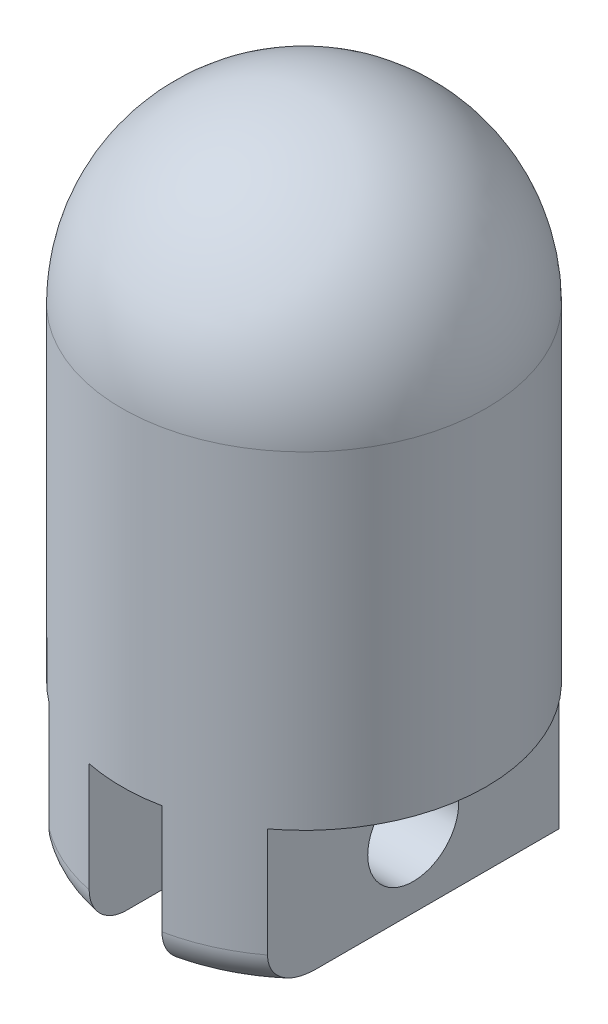
ISO-10303-21;
HEADER;
FILE_DESCRIPTION(('STEP AP214'),'2;1');
FILE_NAME('part.step','',(''),(''),'','','');
FILE_SCHEMA(('AUTOMOTIVE_DESIGN { 1 0 10303 214 1 1 1 1 }'));
ENDSEC;
DATA;
#1=APPLICATION_CONTEXT('core data for automotive mechanical design processes');
#2=APPLICATION_PROTOCOL_DEFINITION('international standard','automotive_design',2000,#1);
#3=PRODUCT_CONTEXT('',#1,'mechanical');
#4=PRODUCT('Part','Part','',(#3));
#5=PRODUCT_RELATED_PRODUCT_CATEGORY('part','',(#4));
#6=PRODUCT_DEFINITION_FORMATION('','',#4);
#7=PRODUCT_DEFINITION_CONTEXT('part definition',#1,'design');
#8=PRODUCT_DEFINITION('design','',#6,#7);
#9=PRODUCT_DEFINITION_SHAPE('','',#8);
#10=(LENGTH_UNIT() NAMED_UNIT(*) SI_UNIT(.MILLI.,.METRE.));
#11=(NAMED_UNIT(*) PLANE_ANGLE_UNIT() SI_UNIT($,.RADIAN.));
#12=(NAMED_UNIT(*) SI_UNIT($,.STERADIAN.) SOLID_ANGLE_UNIT());
#13=UNCERTAINTY_MEASURE_WITH_UNIT(LENGTH_MEASURE(1.E-05),#10,'distance_accuracy_value','');
#14=(GEOMETRIC_REPRESENTATION_CONTEXT(3) GLOBAL_UNCERTAINTY_ASSIGNED_CONTEXT((#13)) GLOBAL_UNIT_ASSIGNED_CONTEXT((#10,
#11,#12)) REPRESENTATION_CONTEXT('',''));
#15=CARTESIAN_POINT('',(0.,0.,0.));
#16=DIRECTION('',(0.,0.,1.));
#17=DIRECTION('',(1.,0.,0.));
#18=AXIS2_PLACEMENT_3D('',#15,#16,#17);
#19=CARTESIAN_POINT('',(0.,0.,0.));
#20=DIRECTION('',(0.,1.,0.));
#21=DIRECTION('',(0.,0.,1.));
#22=AXIS2_PLACEMENT_3D('',#19,#20,#21);
#23=PLANE('',#22);
#24=DIRECTION('',(0.,0.,-1.));
#25=VECTOR('',#24,1.);
#26=CARTESIAN_POINT('',(7.62,0.,10.16));
#27=LINE('',#26,#25);
#28=CARTESIAN_POINT('',(7.62,0.,6.72020833010405));
#29=VERTEX_POINT('',#28);
#30=CARTESIAN_POINT('',(7.62,0.,-10.16));
#31=VERTEX_POINT('',#30);
#32=EDGE_CURVE('E163',#29,#31,#27,.T.);
#33=ORIENTED_EDGE('',*,*,#32,.F.);
#34=CARTESIAN_POINT('',(0.,0.,0.));
#35=DIRECTION('',(0.,1.,0.));
#36=DIRECTION('',(0.,0.,1.));
#37=AXIS2_PLACEMENT_3D('',#34,#35,#36);
#38=CIRCLE('',#37,10.16);
#39=CARTESIAN_POINT('',(2.54,0.,9.83737769936684));
#40=VERTEX_POINT('',#39);
#41=EDGE_CURVE('E285',#29,#40,#38,.F.);
#42=ORIENTED_EDGE('',*,*,#41,.T.);
#43=DIRECTION('',(0.,0.,1.));
#44=VECTOR('',#43,1.);
#45=CARTESIAN_POINT('',(2.54,0.,12.4434078933385));
#46=LINE('',#45,#44);
#47=CARTESIAN_POINT('',(2.54,0.,-12.4434078933385));
#48=VERTEX_POINT('',#47);
#49=EDGE_CURVE('E181',#48,#40,#46,.T.);
#50=ORIENTED_EDGE('',*,*,#49,.F.);
#51=CARTESIAN_POINT('',(0.,0.,0.));
#52=DIRECTION('',(0.,-1.,0.));
#53=DIRECTION('',(0.,0.,-1.));
#54=AXIS2_PLACEMENT_3D('',#51,#52,#53);
#55=CIRCLE('',#54,12.7);
#56=EDGE_CURVE('E212',#48,#31,#55,.T.);
#57=ORIENTED_EDGE('',*,*,#56,.T.);
#58=EDGE_LOOP('',(#33,#42,#50,#57));
#59=FACE_BOUND('',#58,.T.);
#60=ADVANCED_FACE('F39',(#59),#23,.F.);
#61=DIRECTION('',(0.,0.,-1.));
#62=VECTOR('',#61,1.);
#63=CARTESIAN_POINT('',(-2.54,0.,12.4434078933385));
#64=LINE('',#63,#62);
#65=CARTESIAN_POINT('',(-2.54,0.,9.83737769936684));
#66=VERTEX_POINT('',#65);
#67=CARTESIAN_POINT('',(-2.54,0.,-12.4434078933385));
#68=VERTEX_POINT('',#67);
#69=EDGE_CURVE('E155',#66,#68,#64,.T.);
#70=ORIENTED_EDGE('',*,*,#69,.F.);
#71=CARTESIAN_POINT('',(0.,0.,0.));
#72=DIRECTION('',(0.,1.,0.));
#73=DIRECTION('',(0.,0.,1.));
#74=AXIS2_PLACEMENT_3D('',#71,#72,#73);
#75=CIRCLE('',#74,10.16);
#76=CARTESIAN_POINT('',(-7.62,0.,6.72020833010406));
#77=VERTEX_POINT('',#76);
#78=EDGE_CURVE('E234',#66,#77,#75,.F.);
#79=ORIENTED_EDGE('',*,*,#78,.T.);
#80=DIRECTION('',(0.,0.,1.));
#81=VECTOR('',#80,1.);
#82=CARTESIAN_POINT('',(-7.62,0.,10.16));
#83=LINE('',#82,#81);
#84=CARTESIAN_POINT('',(-7.62,0.,-10.16));
#85=VERTEX_POINT('',#84);
#86=EDGE_CURVE('E136',#85,#77,#83,.T.);
#87=ORIENTED_EDGE('',*,*,#86,.F.);
#88=EDGE_CURVE('E151',#85,#68,#55,.T.);
#89=ORIENTED_EDGE('',*,*,#88,.T.);
#90=EDGE_LOOP('',(#70,#79,#87,#89));
#91=FACE_BOUND('',#90,.T.);
#92=ADVANCED_FACE('F337',(#91),#23,.F.);
#93=CARTESIAN_POINT('',(0.,33.02,0.));
#94=DIRECTION('',(0.,-1.,0.));
#95=DIRECTION('',(1.,0.,0.));
#96=AXIS2_PLACEMENT_3D('',#93,#94,#95);
#97=SPHERICAL_SURFACE('',#96,12.7);
#98=CARTESIAN_POINT('',(0.,33.02,0.));
#99=DIRECTION('',(0.,-1.,0.));
#100=DIRECTION('',(0.,0.,-1.));
#101=AXIS2_PLACEMENT_3D('',#98,#99,#100);
#102=CIRCLE('',#101,12.7);
#103=CARTESIAN_POINT('',(0.,33.02,-12.7));
#104=VERTEX_POINT('',#103);
#105=EDGE_CURVE('E216',#104,#104,#102,.T.);
#106=ORIENTED_EDGE('',*,*,#105,.F.);
#107=EDGE_LOOP('',(#106));
#108=FACE_BOUND('',#107,.T.);
#109=ADVANCED_FACE('F341',(#108),#97,.T.);
#110=CARTESIAN_POINT('',(0.,0.,0.));
#111=DIRECTION('',(0.,-1.,0.));
#112=DIRECTION('',(0.,0.,-1.));
#113=AXIS2_PLACEMENT_3D('',#110,#111,#112);
#114=CYLINDRICAL_SURFACE('',#113,12.7);
#115=DIRECTION('',(0.,-1.,0.));
#116=VECTOR('',#115,1.);
#117=CARTESIAN_POINT('',(-7.62,10.16,10.16));
#118=LINE('',#117,#116);
#119=CARTESIAN_POINT('',(-7.62,10.16,10.16));
#120=VERTEX_POINT('',#119);
#121=CARTESIAN_POINT('',(-7.62,2.54,10.16));
#122=VERTEX_POINT('',#121);
#123=EDGE_CURVE('E143',#120,#122,#118,.T.);
#124=ORIENTED_EDGE('',*,*,#123,.T.);
#125=CARTESIAN_POINT('',(0.,2.54,0.));
#126=DIRECTION('',(0.,1.,0.));
#127=DIRECTION('',(0.,0.,1.));
#128=AXIS2_PLACEMENT_3D('',#125,#126,#127);
#129=CIRCLE('',#128,12.7);
#130=CARTESIAN_POINT('',(-2.54,2.54,12.4434078933385));
#131=VERTEX_POINT('',#130);
#132=EDGE_CURVE('E294',#122,#131,#129,.T.);
#133=ORIENTED_EDGE('',*,*,#132,.T.);
#134=DIRECTION('',(0.,-1.,0.));
#135=VECTOR('',#134,1.);
#136=CARTESIAN_POINT('',(-2.54,10.16,12.4434078933385));
#137=LINE('',#136,#135);
#138=CARTESIAN_POINT('',(-2.54,10.16,12.4434078933385));
#139=VERTEX_POINT('',#138);
#140=EDGE_CURVE('E193',#139,#131,#137,.T.);
#141=ORIENTED_EDGE('',*,*,#140,.F.);
#142=CARTESIAN_POINT('',(0.,10.16,0.));
#143=DIRECTION('',(0.,-1.,0.));
#144=DIRECTION('',(0.,0.,-1.));
#145=AXIS2_PLACEMENT_3D('',#142,#143,#144);
#146=CIRCLE('',#145,12.7);
#147=CARTESIAN_POINT('',(2.54,10.16,12.4434078933385));
#148=VERTEX_POINT('',#147);
#149=EDGE_CURVE('E176',#148,#139,#146,.T.);
#150=ORIENTED_EDGE('',*,*,#149,.F.);
#151=DIRECTION('',(0.,-1.,0.));
#152=VECTOR('',#151,1.);
#153=CARTESIAN_POINT('',(2.54,10.16,12.4434078933385));
#154=LINE('',#153,#152);
#155=CARTESIAN_POINT('',(2.54,2.54,12.4434078933385));
#156=VERTEX_POINT('',#155);
#157=EDGE_CURVE('E199',#148,#156,#154,.T.);
#158=ORIENTED_EDGE('',*,*,#157,.T.);
#159=CARTESIAN_POINT('',(0.,2.54,0.));
#160=DIRECTION('',(0.,1.,0.));
#161=DIRECTION('',(0.,0.,1.));
#162=AXIS2_PLACEMENT_3D('',#159,#160,#161);
#163=CIRCLE('',#162,12.7);
#164=CARTESIAN_POINT('',(7.62,2.54,10.16));
#165=VERTEX_POINT('',#164);
#166=EDGE_CURVE('E246',#156,#165,#163,.T.);
#167=ORIENTED_EDGE('',*,*,#166,.T.);
#168=DIRECTION('',(0.,-1.,0.));
#169=VECTOR('',#168,1.);
#170=CARTESIAN_POINT('',(7.62,10.16,10.16));
#171=LINE('',#170,#169);
#172=CARTESIAN_POINT('',(7.62,10.16,10.16));
#173=VERTEX_POINT('',#172);
#174=EDGE_CURVE('E166',#173,#165,#171,.T.);
#175=ORIENTED_EDGE('',*,*,#174,.F.);
#176=CARTESIAN_POINT('',(0.,10.16,0.));
#177=DIRECTION('',(0.,-1.,0.));
#178=DIRECTION('',(0.,0.,-1.));
#179=AXIS2_PLACEMENT_3D('',#176,#177,#178);
#180=CIRCLE('',#179,12.7);
#181=CARTESIAN_POINT('',(7.62,10.16,-10.16));
#182=VERTEX_POINT('',#181);
#183=EDGE_CURVE('E159',#182,#173,#180,.T.);
#184=ORIENTED_EDGE('',*,*,#183,.F.);
#185=DIRECTION('',(0.,-1.,0.));
#186=VECTOR('',#185,1.);
#187=CARTESIAN_POINT('',(7.62,10.16,-10.16));
#188=LINE('',#187,#186);
#189=EDGE_CURVE('E170',#182,#31,#188,.T.);
#190=ORIENTED_EDGE('',*,*,#189,.T.);
#191=ORIENTED_EDGE('',*,*,#56,.F.);
#192=DIRECTION('',(0.,-1.,0.));
#193=VECTOR('',#192,1.);
#194=CARTESIAN_POINT('',(2.54,10.16,-12.4434078933385));
#195=LINE('',#194,#193);
#196=CARTESIAN_POINT('',(2.54,10.16,-12.4434078933385));
#197=VERTEX_POINT('',#196);
#198=EDGE_CURVE('E203',#197,#48,#195,.T.);
#199=ORIENTED_EDGE('',*,*,#198,.F.);
#200=CARTESIAN_POINT('',(0.,10.16,0.));
#201=DIRECTION('',(0.,-1.,0.));
#202=DIRECTION('',(0.,0.,-1.));
#203=AXIS2_PLACEMENT_3D('',#200,#201,#202);
#204=CIRCLE('',#203,12.7);
#205=CARTESIAN_POINT('',(-2.54,10.16,-12.4434078933385));
#206=VERTEX_POINT('',#205);
#207=EDGE_CURVE('E186',#206,#197,#204,.T.);
#208=ORIENTED_EDGE('',*,*,#207,.F.);
#209=DIRECTION('',(0.,-1.,0.));
#210=VECTOR('',#209,1.);
#211=CARTESIAN_POINT('',(-2.54,10.16,-12.4434078933385));
#212=LINE('',#211,#210);
#213=EDGE_CURVE('E206',#206,#68,#212,.T.);
#214=ORIENTED_EDGE('',*,*,#213,.T.);
#215=ORIENTED_EDGE('',*,*,#88,.F.);
#216=DIRECTION('',(0.,-1.,0.));
#217=VECTOR('',#216,1.);
#218=CARTESIAN_POINT('',(-7.62,10.16,-10.16));
#219=LINE('',#218,#217);
#220=CARTESIAN_POINT('',(-7.62,10.16,-10.16));
#221=VERTEX_POINT('',#220);
#222=EDGE_CURVE('E141',#221,#85,#219,.T.);
#223=ORIENTED_EDGE('',*,*,#222,.F.);
#224=CARTESIAN_POINT('',(0.,10.16,0.));
#225=DIRECTION('',(0.,-1.,0.));
#226=DIRECTION('',(0.,0.,-1.));
#227=AXIS2_PLACEMENT_3D('',#224,#225,#226);
#228=CIRCLE('',#227,12.7);
#229=EDGE_CURVE('E127',#120,#221,#228,.T.);
#230=ORIENTED_EDGE('',*,*,#229,.F.);
#231=EDGE_LOOP('',(#124,#133,#141,#150,#158,#167,#175,#184,#190,#191,#199,#208,#214,#215,#223,#230));
#232=FACE_BOUND('',#231,.T.);
#233=ORIENTED_EDGE('',*,*,#105,.T.);
#234=EDGE_LOOP('',(#233));
#235=FACE_BOUND('',#234,.T.);
#236=ADVANCED_FACE('F147',(#232,#235),#114,.T.);
#237=CARTESIAN_POINT('',(0.,10.16,0.));
#238=DIRECTION('',(0.,-1.,0.));
#239=DIRECTION('',(0.,0.,-1.));
#240=AXIS2_PLACEMENT_3D('',#237,#238,#239);
#241=PLANE('',#240);
#242=CARTESIAN_POINT('',(0.,10.16,0.));
#243=DIRECTION('',(0.,-1.,0.));
#244=DIRECTION('',(0.,0.,-1.));
#245=AXIS2_PLACEMENT_3D('',#242,#243,#244);
#246=CIRCLE('',#245,2.54);
#247=CARTESIAN_POINT('',(-2.54,10.16,0.));
#248=VERTEX_POINT('',#247);
#249=CARTESIAN_POINT('',(2.54,10.16,0.));
#250=VERTEX_POINT('',#249);
#251=EDGE_CURVE('E227',#248,#250,#246,.F.);
#252=ORIENTED_EDGE('',*,*,#251,.T.);
#253=DIRECTION('',(0.,0.,1.));
#254=VECTOR('',#253,1.);
#255=CARTESIAN_POINT('',(2.54,10.16,12.4434078933385));
#256=LINE('',#255,#254);
#257=EDGE_CURVE('E189',#250,#148,#256,.T.);
#258=ORIENTED_EDGE('',*,*,#257,.T.);
#259=ORIENTED_EDGE('',*,*,#149,.T.);
#260=DIRECTION('',(0.,0.,-1.));
#261=VECTOR('',#260,1.);
#262=CARTESIAN_POINT('',(-2.54,10.16,12.4434078933385));
#263=LINE('',#262,#261);
#264=EDGE_CURVE('E182',#139,#248,#263,.T.);
#265=ORIENTED_EDGE('',*,*,#264,.T.);
#266=EDGE_LOOP('',(#252,#258,#259,#265));
#267=FACE_BOUND('',#266,.T.);
#268=ADVANCED_FACE('F267',(#267),#241,.T.);
#269=EDGE_CURVE('E224',#250,#248,#246,.F.);
#270=ORIENTED_EDGE('',*,*,#269,.T.);
#271=EDGE_CURVE('E180',#248,#206,#263,.T.);
#272=ORIENTED_EDGE('',*,*,#271,.T.);
#273=ORIENTED_EDGE('',*,*,#207,.T.);
#274=EDGE_CURVE('E190',#197,#250,#256,.T.);
#275=ORIENTED_EDGE('',*,*,#274,.T.);
#276=EDGE_LOOP('',(#270,#272,#273,#275));
#277=FACE_BOUND('',#276,.T.);
#278=ADVANCED_FACE('F270',(#277),#241,.T.);
#279=CARTESIAN_POINT('',(2.54,10.16,12.4434078933385));
#280=DIRECTION('',(1.,0.,0.));
#281=DIRECTION('',(0.,0.,-1.));
#282=AXIS2_PLACEMENT_3D('',#279,#280,#281);
#283=PLANE('',#282);
#284=CARTESIAN_POINT('',(2.54,5.08,0.));
#285=DIRECTION('',(1.,0.,0.));
#286=DIRECTION('',(0.,0.,-1.));
#287=AXIS2_PLACEMENT_3D('',#284,#285,#286);
#288=CIRCLE('',#287,3.175);
#289=CARTESIAN_POINT('',(2.54,5.08,-3.175));
#290=VERTEX_POINT('',#289);
#291=EDGE_CURVE('E169',#290,#290,#288,.T.);
#292=ORIENTED_EDGE('',*,*,#291,.T.);
#293=EDGE_LOOP('',(#292));
#294=FACE_BOUND('',#293,.T.);
#295=ORIENTED_EDGE('',*,*,#49,.T.);
#296=CARTESIAN_POINT('',(2.54,0.,9.83737769936684));
#297=CARTESIAN_POINT('',(2.54,1.45425618167772E-06,9.91230037919097));
#298=CARTESIAN_POINT('',(2.54,0.00310981694239159,9.98718958698183));
#299=CARTESIAN_POINT('',(2.54,0.0155436658062321,10.1364549391743));
#300=CARTESIAN_POINT('',(2.54,0.02486959755277,10.2108310464197));
#301=CARTESIAN_POINT('',(2.54,0.0621632906921143,10.4324166619154));
#302=CARTESIAN_POINT('',(2.54,0.0994469487679672,10.578173392806));
#303=CARTESIAN_POINT('',(2.54,0.198147270173078,10.8613867869284));
#304=CARTESIAN_POINT('',(2.54,0.259589645281355,10.9988344265028));
#305=CARTESIAN_POINT('',(2.54,0.405105398356876,11.261129326273));
#306=CARTESIAN_POINT('',(2.54,0.48916633258982,11.3859834630861));
#307=CARTESIAN_POINT('',(2.54,0.675862847898282,11.6169487416195));
#308=CARTESIAN_POINT('',(2.54,0.778107822291197,11.7233756291323));
#309=CARTESIAN_POINT('',(2.54,0.999446084232905,11.9170573290163));
#310=CARTESIAN_POINT('',(2.54,1.11854228435804,12.0043088204298));
#311=CARTESIAN_POINT('',(2.54,1.36703211456297,12.1549133561521));
#312=CARTESIAN_POINT('',(2.54,1.49610667508061,12.2187937971196));
#313=CARTESIAN_POINT('',(2.54,1.76323440237714,12.3234975537076));
#314=CARTESIAN_POINT('',(2.54,1.90127928169638,12.3643418234144));
#315=CARTESIAN_POINT('',(2.54,2.12369890518237,12.4097791905788));
#316=CARTESIAN_POINT('',(2.54,2.20651763910892,12.4223841804546));
#317=CARTESIAN_POINT('',(2.54,2.37287781294579,12.4391952140899));
#318=CARTESIAN_POINT('',(2.54,2.45641798662608,12.4434137919833));
#319=CARTESIAN_POINT('',(2.54,2.54,12.4434078933385));
#320=B_SPLINE_CURVE_WITH_KNOTS('',3,(#296,#297,#298,#299,#300,#301,#302,#303,#304,#305,#306,
#307,#308,#309,#310,#311,#312,#313,#314,#315,#316,#317,#318,#319),.UNSPECIFIED.,.F.,.F.,(4,2,2,
2,2,2,2,2,2,2,2,4),(0.,0.224635584073767,0.449287267911123,0.898324217122332,1.34784036920845,
1.79710972118426,2.23769161945873,2.67834976141615,3.10834056745386,3.53793961324235,
3.78887256919796,4.0394302038591),.UNSPECIFIED.);
#321=EDGE_CURVE('E54',#40,#156,#320,.T.);
#322=ORIENTED_EDGE('',*,*,#321,.T.);
#323=ORIENTED_EDGE('',*,*,#157,.F.);
#324=ORIENTED_EDGE('',*,*,#257,.F.);
#325=ORIENTED_EDGE('',*,*,#274,.F.);
#326=ORIENTED_EDGE('',*,*,#198,.T.);
#327=EDGE_LOOP('',(#295,#322,#323,#324,#325,#326));
#328=FACE_BOUND('',#327,.T.);
#329=ADVANCED_FACE('F272',(#294,#328),#283,.F.);
#330=CARTESIAN_POINT('',(-2.54,10.16,12.4434078933385));
#331=DIRECTION('',(-1.,0.,0.));
#332=DIRECTION('',(0.,0.,1.));
#333=AXIS2_PLACEMENT_3D('',#330,#331,#332);
#334=PLANE('',#333);
#335=CARTESIAN_POINT('',(-2.54,5.08,0.));
#336=DIRECTION('',(-1.,0.,0.));
#337=DIRECTION('',(0.,0.,1.));
#338=AXIS2_PLACEMENT_3D('',#335,#336,#337);
#339=CIRCLE('',#338,3.175);
#340=CARTESIAN_POINT('',(-2.54,5.08,3.175));
#341=VERTEX_POINT('',#340);
#342=EDGE_CURVE('E232',#341,#341,#339,.T.);
#343=ORIENTED_EDGE('',*,*,#342,.T.);
#344=EDGE_LOOP('',(#343));
#345=FACE_BOUND('',#344,.T.);
#346=ORIENTED_EDGE('',*,*,#140,.T.);
#347=CARTESIAN_POINT('',(-2.54,2.54,12.4434078933385));
#348=CARTESIAN_POINT('',(-2.54,2.46967063237577,12.4434154470113));
#349=CARTESIAN_POINT('',(-2.54,2.39934485357642,12.4404267278602));
#350=CARTESIAN_POINT('',(-2.54,2.25920319252276,12.4285150367311));
#351=CARTESIAN_POINT('',(-2.54,2.18938726943151,12.4195925454082));
#352=CARTESIAN_POINT('',(-2.54,2.0508429922709,12.3958863873355));
#353=CARTESIAN_POINT('',(-2.54,1.98211338963525,12.3811100493502));
#354=CARTESIAN_POINT('',(-2.54,1.84616156852946,12.3458265144606));
#355=CARTESIAN_POINT('',(-2.54,1.77893934087272,12.3253193524927));
#356=CARTESIAN_POINT('',(-2.54,1.58020157604863,12.2553951049839));
#357=CARTESIAN_POINT('',(-2.54,1.45153515102383,12.1975614990708));
#358=CARTESIAN_POINT('',(-2.54,1.20572174178529,12.0613038825231));
#359=CARTESIAN_POINT('',(-2.54,1.08857431180475,11.982880669105));
#360=CARTESIAN_POINT('',(-2.54,0.867990402614351,11.8070995623068));
#361=CARTESIAN_POINT('',(-2.54,0.764664812840586,11.7096023869722));
#362=CARTESIAN_POINT('',(-2.54,0.575468544765382,11.4989271370242));
#363=CARTESIAN_POINT('',(-2.54,0.489601028382851,11.3857462280823));
#364=CARTESIAN_POINT('',(-2.54,0.335940087501158,11.1446164847891));
#365=CARTESIAN_POINT('',(-2.54,0.268530705758163,11.0164232223069));
#366=CARTESIAN_POINT('',(-2.54,0.155607960316393,10.7507343228132));
#367=CARTESIAN_POINT('',(-2.54,0.110091838523056,10.6132398600497));
#368=CARTESIAN_POINT('',(-2.54,0.0506877983667472,10.3690151979483));
#369=CARTESIAN_POINT('',(-2.54,0.0316698297012548,10.2634985640939));
#370=CARTESIAN_POINT('',(-2.54,0.00632611211670065,10.051121449083));
#371=CARTESIAN_POINT('',(-2.54,-1.98484952771332E-05,9.94426338192671));
#372=CARTESIAN_POINT('',(-2.54,0.,9.83737769936684));
#373=B_SPLINE_CURVE_WITH_KNOTS('',3,(#347,#348,#349,#350,#351,#352,#353,#354,#355,#356,#357,
#358,#359,#360,#361,#362,#363,#364,#365,#366,#367,#368,#369,#370,#371,#372),.UNSPECIFIED.,.F.,
.F.,(4,2,2,2,2,2,2,2,2,2,2,2,4),(0.,0.210918249149259,0.421819415305526,0.632457372480104,
0.843094045585046,1.26412750353444,1.68514466173996,2.10935936996745,2.53365084153177,
2.9661951343593,3.39868492133767,3.71960780058626,4.04001840172957),.UNSPECIFIED.);
#374=EDGE_CURVE('E288',#131,#66,#373,.T.);
#375=ORIENTED_EDGE('',*,*,#374,.T.);
#376=ORIENTED_EDGE('',*,*,#69,.T.);
#377=ORIENTED_EDGE('',*,*,#213,.F.);
#378=ORIENTED_EDGE('',*,*,#271,.F.);
#379=ORIENTED_EDGE('',*,*,#264,.F.);
#380=EDGE_LOOP('',(#346,#375,#376,#377,#378,#379));
#381=FACE_BOUND('',#380,.T.);
#382=ADVANCED_FACE('F255',(#345,#381),#334,.F.);
#383=CARTESIAN_POINT('',(-7.62,10.16,10.16));
#384=DIRECTION('',(1.,0.,0.));
#385=DIRECTION('',(0.,0.,-1.));
#386=AXIS2_PLACEMENT_3D('',#383,#384,#385);
#387=PLANE('',#386);
#388=CARTESIAN_POINT('',(-7.62,5.08,0.));
#389=DIRECTION('',(-1.,0.,0.));
#390=DIRECTION('',(0.,0.,1.));
#391=AXIS2_PLACEMENT_3D('',#388,#389,#390);
#392=CIRCLE('',#391,3.175);
#393=CARTESIAN_POINT('',(-7.62,5.08,3.175));
#394=VERTEX_POINT('',#393);
#395=EDGE_CURVE('E233',#394,#394,#392,.T.);
#396=ORIENTED_EDGE('',*,*,#395,.F.);
#397=EDGE_LOOP('',(#396));
#398=FACE_BOUND('',#397,.T.);
#399=ORIENTED_EDGE('',*,*,#86,.T.);
#400=CARTESIAN_POINT('',(-7.62,0.,6.72020833010406));
#401=CARTESIAN_POINT('',(-7.62,-7.47413466262009E-05,6.99327990287421));
#402=CARTESIAN_POINT('',(-7.62,0.0193476233139783,7.26867863347754));
#403=CARTESIAN_POINT('',(-7.62,0.106175815575614,7.81491676110583));
#404=CARTESIAN_POINT('',(-7.62,0.174158048363267,8.08566098800379));
#405=CARTESIAN_POINT('',(-7.62,0.330202589140558,8.50572625033474));
#406=CARTESIAN_POINT('',(-7.62,0.400388070445191,8.66158064871892));
#407=CARTESIAN_POINT('',(-7.62,0.563805608258863,8.96011014989274));
#408=CARTESIAN_POINT('',(-7.62,0.656936899856236,9.10283922552907));
#409=CARTESIAN_POINT('',(-7.62,0.849628854295138,9.34773236899358));
#410=CARTESIAN_POINT('',(-7.62,0.94560747612532,9.45270636094602));
#411=CARTESIAN_POINT('',(-7.62,1.15378585705436,9.64565066826041));
#412=CARTESIAN_POINT('',(-7.62,1.26599581181159,9.73361021427731));
#413=CARTESIAN_POINT('',(-7.62,1.44529437515778,9.84952483403398));
#414=CARTESIAN_POINT('',(-7.62,1.50721950643727,9.88562806891205));
#415=CARTESIAN_POINT('',(-7.62,1.63422624334214,9.95174325933018));
#416=CARTESIAN_POINT('',(-7.62,1.69930608040803,9.98175857998488));
#417=CARTESIAN_POINT('',(-7.62,1.83201255255219,10.0351448409041));
#418=CARTESIAN_POINT('',(-7.62,1.89963477966944,10.058526730362));
#419=CARTESIAN_POINT('',(-7.62,2.03687651112399,10.0982731683472));
#420=CARTESIAN_POINT('',(-7.62,2.10649472654276,10.1146421412512));
#421=CARTESIAN_POINT('',(-7.62,2.23669220288616,10.1381834984238));
#422=CARTESIAN_POINT('',(-7.62,2.29709235328131,10.1463553862042));
#423=CARTESIAN_POINT('',(-7.62,2.41832511963126,10.157267723823));
#424=CARTESIAN_POINT('',(-7.62,2.47915729303315,10.1600130994335));
#425=CARTESIAN_POINT('',(-7.62,2.54,10.16));
#426=B_SPLINE_CURVE_WITH_KNOTS('',3,(#400,#401,#402,#403,#404,#405,#406,#407,#408,#409,#410,
#411,#412,#413,#414,#415,#416,#417,#418,#419,#420,#421,#422,#423,#424,#425),.UNSPECIFIED.,.F.,
.F.,(4,2,2,2,2,2,2,2,2,2,2,2,4),(0.,0.822329418337463,1.6545856392476,2.16562723963451,
2.67446343320547,3.09953770525556,3.52488015523001,3.73965037300011,3.95430155034069,
4.16859633351735,4.38275572052489,4.5653690206287,4.74781648210551),.UNSPECIFIED.);
#427=EDGE_CURVE('E238',#77,#122,#426,.T.);
#428=ORIENTED_EDGE('',*,*,#427,.T.);
#429=ORIENTED_EDGE('',*,*,#123,.F.);
#430=DIRECTION('',(0.,0.,1.));
#431=VECTOR('',#430,1.);
#432=CARTESIAN_POINT('',(-7.62,10.16,10.16));
#433=LINE('',#432,#431);
#434=EDGE_CURVE('E130',#221,#120,#433,.T.);
#435=ORIENTED_EDGE('',*,*,#434,.F.);
#436=ORIENTED_EDGE('',*,*,#222,.T.);
#437=EDGE_LOOP('',(#399,#428,#429,#435,#436));
#438=FACE_BOUND('',#437,.T.);
#439=ADVANCED_FACE('F140',(#398,#438),#387,.F.);
#440=CARTESIAN_POINT('',(0.,10.16,0.));
#441=DIRECTION('',(0.,-1.,0.));
#442=DIRECTION('',(0.,0.,-1.));
#443=AXIS2_PLACEMENT_3D('',#440,#441,#442);
#444=PLANE('',#443);
#445=ORIENTED_EDGE('',*,*,#229,.T.);
#446=ORIENTED_EDGE('',*,*,#434,.T.);
#447=EDGE_LOOP('',(#445,#446));
#448=FACE_BOUND('',#447,.T.);
#449=ADVANCED_FACE('F129',(#448),#444,.T.);
#450=CARTESIAN_POINT('',(7.62,10.16,10.16));
#451=DIRECTION('',(-1.,0.,0.));
#452=DIRECTION('',(0.,0.,1.));
#453=AXIS2_PLACEMENT_3D('',#450,#451,#452);
#454=PLANE('',#453);
#455=CARTESIAN_POINT('',(7.62,5.08,0.));
#456=DIRECTION('',(-1.,0.,0.));
#457=DIRECTION('',(0.,0.,1.));
#458=AXIS2_PLACEMENT_3D('',#455,#456,#457);
#459=CIRCLE('',#458,3.175);
#460=CARTESIAN_POINT('',(7.62,5.08,3.175));
#461=VERTEX_POINT('',#460);
#462=EDGE_CURVE('E228',#461,#461,#459,.T.);
#463=ORIENTED_EDGE('',*,*,#462,.T.);
#464=EDGE_LOOP('',(#463));
#465=FACE_BOUND('',#464,.T.);
#466=ORIENTED_EDGE('',*,*,#174,.T.);
#467=CARTESIAN_POINT('',(7.62,2.54,10.16));
#468=CARTESIAN_POINT('',(7.62,2.47932871801413,10.160013422572));
#469=CARTESIAN_POINT('',(7.62,2.41866415701389,10.1572831063146));
#470=CARTESIAN_POINT('',(7.62,2.2978418724177,10.1464377967899));
#471=CARTESIAN_POINT('',(7.62,2.2376839558966,10.138324956614));
#472=CARTESIAN_POINT('',(7.62,2.11862855106172,10.1168730079301));
#473=CARTESIAN_POINT('',(7.62,2.05972614470898,10.1035612158783));
#474=CARTESIAN_POINT('',(7.62,1.94330175148668,10.0719120039639));
#475=CARTESIAN_POINT('',(7.62,1.88577984067071,10.0535743079047));
#476=CARTESIAN_POINT('',(7.62,1.71602141232677,9.99141574586202));
#477=CARTESIAN_POINT('',(7.62,1.60633792199534,9.94040237008355));
#478=CARTESIAN_POINT('',(7.62,1.39643687655324,9.82166143509589));
#479=CARTESIAN_POINT('',(7.62,1.29623012032819,9.75391511838246));
#480=CARTESIAN_POINT('',(7.62,1.10140396209762,9.60017195503882));
#481=CARTESIAN_POINT('',(7.62,1.00743968410422,9.51334813782557));
#482=CARTESIAN_POINT('',(7.62,0.832811559060195,9.32739554876275));
#483=CARTESIAN_POINT('',(7.62,0.752146257718205,9.22826812443806));
#484=CARTESIAN_POINT('',(7.62,0.56901035013809,8.97113171733957));
#485=CARTESIAN_POINT('',(7.62,0.474380686677983,8.80751855999478));
#486=CARTESIAN_POINT('',(7.62,0.312580853764836,8.46662437064915));
#487=CARTESIAN_POINT('',(7.62,0.24554814462936,8.28928002390191));
#488=CARTESIAN_POINT('',(7.62,0.123485313346866,7.88241693388359));
#489=CARTESIAN_POINT('',(7.62,0.0755124919327639,7.6508331222634));
#490=CARTESIAN_POINT('',(7.62,0.0139793253253,7.18584265831651));
#491=CARTESIAN_POINT('',(7.62,1.01513079260754E-05,6.95249184834465));
#492=CARTESIAN_POINT('',(7.62,0.,6.72020833010406));
#493=B_SPLINE_CURVE_WITH_KNOTS('',3,(#467,#468,#469,#470,#471,#472,#473,#474,#475,#476,#477,
#478,#479,#480,#481,#482,#483,#484,#485,#486,#487,#488,#489,#490,#491,#492),.UNSPECIFIED.,.F.,
.F.,(4,2,2,2,2,2,2,2,2,2,2,2,4),(0.,0.181941273273647,0.363809811116228,0.544735355538573,
0.725670844648793,1.08677612239183,1.44828804845431,1.83064058095025,2.21295127403603,
2.77684806807466,3.34352060408734,4.05019972676753,4.74833947495295),.UNSPECIFIED.);
#494=EDGE_CURVE('E11',#165,#29,#493,.T.);
#495=ORIENTED_EDGE('',*,*,#494,.T.);
#496=ORIENTED_EDGE('',*,*,#32,.T.);
#497=ORIENTED_EDGE('',*,*,#189,.F.);
#498=DIRECTION('',(0.,0.,-1.));
#499=VECTOR('',#498,1.);
#500=CARTESIAN_POINT('',(7.62,10.16,10.16));
#501=LINE('',#500,#499);
#502=EDGE_CURVE('E162',#173,#182,#501,.T.);
#503=ORIENTED_EDGE('',*,*,#502,.F.);
#504=EDGE_LOOP('',(#466,#495,#496,#497,#503));
#505=FACE_BOUND('',#504,.T.);
#506=ADVANCED_FACE('F261',(#465,#505),#454,.F.);
#507=CARTESIAN_POINT('',(0.,10.16,0.));
#508=DIRECTION('',(0.,-1.,0.));
#509=DIRECTION('',(0.,0.,-1.));
#510=AXIS2_PLACEMENT_3D('',#507,#508,#509);
#511=PLANE('',#510);
#512=ORIENTED_EDGE('',*,*,#183,.T.);
#513=ORIENTED_EDGE('',*,*,#502,.T.);
#514=EDGE_LOOP('',(#512,#513));
#515=FACE_BOUND('',#514,.T.);
#516=ADVANCED_FACE('F258',(#515),#511,.T.);
#517=CARTESIAN_POINT('',(0.,0.,0.));
#518=DIRECTION('',(0.,-1.,0.));
#519=DIRECTION('',(0.,0.,-1.));
#520=AXIS2_PLACEMENT_3D('',#517,#518,#519);
#521=CYLINDRICAL_SURFACE('',#520,2.54);
#522=CARTESIAN_POINT('',(0.,22.86,0.));
#523=DIRECTION('',(0.,-1.,0.));
#524=DIRECTION('',(0.,0.,-1.));
#525=AXIS2_PLACEMENT_3D('',#522,#523,#524);
#526=CIRCLE('',#525,2.54);
#527=CARTESIAN_POINT('',(0.,22.86,-2.54));
#528=VERTEX_POINT('',#527);
#529=EDGE_CURVE('E220',#528,#528,#526,.T.);
#530=ORIENTED_EDGE('',*,*,#529,.F.);
#531=EDGE_LOOP('',(#530));
#532=FACE_BOUND('',#531,.T.);
#533=ORIENTED_EDGE('',*,*,#251,.F.);
#534=ORIENTED_EDGE('',*,*,#269,.F.);
#535=EDGE_LOOP('',(#533,#534));
#536=FACE_BOUND('',#535,.T.);
#537=ADVANCED_FACE('F260',(#532,#536),#521,.F.);
#538=CARTESIAN_POINT('',(0.,33.02,0.));
#539=DIRECTION('',(0.,-1.,0.));
#540=DIRECTION('',(-1.,0.,0.));
#541=AXIS2_PLACEMENT_3D('',#538,#539,#540);
#542=SPHERICAL_SURFACE('',#541,10.4726882890689);
#543=ORIENTED_EDGE('',*,*,#529,.T.);
#544=EDGE_LOOP('',(#543));
#545=FACE_BOUND('',#544,.T.);
#546=ADVANCED_FACE('F326',(#545),#542,.F.);
#547=CARTESIAN_POINT('',(12.7,5.08,0.));
#548=DIRECTION('',(-1.,0.,0.));
#549=DIRECTION('',(0.,0.,1.));
#550=AXIS2_PLACEMENT_3D('',#547,#548,#549);
#551=CYLINDRICAL_SURFACE('',#550,3.175);
#552=ORIENTED_EDGE('',*,*,#462,.F.);
#553=EDGE_LOOP('',(#552));
#554=FACE_BOUND('',#553,.T.);
#555=ORIENTED_EDGE('',*,*,#291,.F.);
#556=EDGE_LOOP('',(#555));
#557=FACE_BOUND('',#556,.T.);
#558=ADVANCED_FACE('F332',(#554,#557),#551,.F.);
#559=ORIENTED_EDGE('',*,*,#395,.T.);
#560=EDGE_LOOP('',(#559));
#561=FACE_BOUND('',#560,.T.);
#562=ORIENTED_EDGE('',*,*,#342,.F.);
#563=EDGE_LOOP('',(#562));
#564=FACE_BOUND('',#563,.T.);
#565=ADVANCED_FACE('F364',(#561,#564),#551,.F.);
#566=CARTESIAN_POINT('',(0.,2.54,0.));
#567=DIRECTION('',(0.,1.,0.));
#568=DIRECTION('',(0.,0.,1.));
#569=AXIS2_PLACEMENT_3D('',#566,#567,#568);
#570=TOROIDAL_SURFACE('',#569,10.16,2.54);
#571=ORIENTED_EDGE('',*,*,#374,.F.);
#572=ORIENTED_EDGE('',*,*,#132,.F.);
#573=ORIENTED_EDGE('',*,*,#427,.F.);
#574=ORIENTED_EDGE('',*,*,#78,.F.);
#575=EDGE_LOOP('',(#571,#572,#573,#574));
#576=FACE_BOUND('',#575,.T.);
#577=ADVANCED_FACE('F248',(#576),#570,.T.);
#578=CARTESIAN_POINT('',(0.,2.54,0.));
#579=DIRECTION('',(0.,1.,0.));
#580=DIRECTION('',(0.,0.,1.));
#581=AXIS2_PLACEMENT_3D('',#578,#579,#580);
#582=TOROIDAL_SURFACE('',#581,10.16,2.54);
#583=ORIENTED_EDGE('',*,*,#494,.F.);
#584=ORIENTED_EDGE('',*,*,#166,.F.);
#585=ORIENTED_EDGE('',*,*,#321,.F.);
#586=ORIENTED_EDGE('',*,*,#41,.F.);
#587=EDGE_LOOP('',(#583,#584,#585,#586));
#588=FACE_BOUND('',#587,.T.);
#589=ADVANCED_FACE('F41',(#588),#582,.T.);
#590=CLOSED_SHELL('',(#60,#92,#109,#236,#268,#278,#329,#382,#439,#449,#506,#516,#537,#546,#558,
#565,#577,#589));
#591=MANIFOLD_SOLID_BREP('B2',#590);
#592=ADVANCED_BREP_SHAPE_REPRESENTATION('',(#18,#591),#14);
#593=SHAPE_DEFINITION_REPRESENTATION(#9,#592);
ENDSEC;
END-ISO-10303-21;
